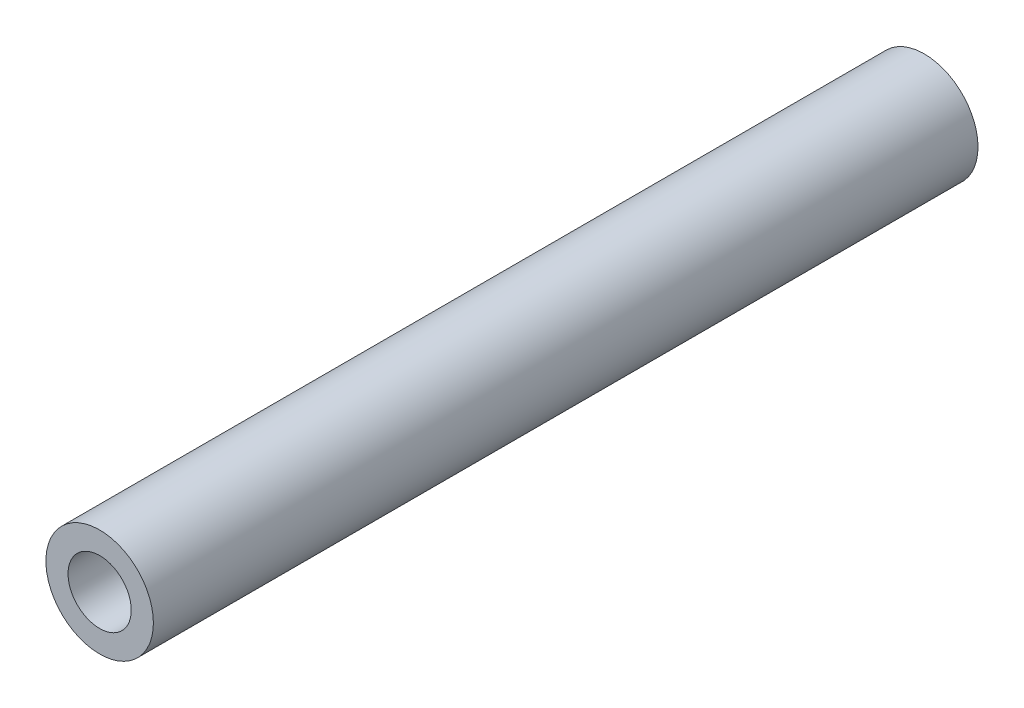
ISO-10303-21;
HEADER;
FILE_DESCRIPTION(('STEP AP214'),'2;1');
FILE_NAME('part.step','',(''),(''),'','','');
FILE_SCHEMA(('AUTOMOTIVE_DESIGN { 1 0 10303 214 1 1 1 1 }'));
ENDSEC;
DATA;
#1=APPLICATION_CONTEXT('core data for automotive mechanical design processes');
#2=APPLICATION_PROTOCOL_DEFINITION('international standard','automotive_design',2000,#1);
#3=PRODUCT_CONTEXT('',#1,'mechanical');
#4=PRODUCT('Part','Part','',(#3));
#5=PRODUCT_RELATED_PRODUCT_CATEGORY('part','',(#4));
#6=PRODUCT_DEFINITION_FORMATION('','',#4);
#7=PRODUCT_DEFINITION_CONTEXT('part definition',#1,'design');
#8=PRODUCT_DEFINITION('design','',#6,#7);
#9=PRODUCT_DEFINITION_SHAPE('','',#8);
#10=(LENGTH_UNIT() NAMED_UNIT(*) SI_UNIT(.MILLI.,.METRE.));
#11=(NAMED_UNIT(*) PLANE_ANGLE_UNIT() SI_UNIT($,.RADIAN.));
#12=(NAMED_UNIT(*) SI_UNIT($,.STERADIAN.) SOLID_ANGLE_UNIT());
#13=UNCERTAINTY_MEASURE_WITH_UNIT(LENGTH_MEASURE(1.E-05),#10,'distance_accuracy_value','');
#14=(GEOMETRIC_REPRESENTATION_CONTEXT(3) GLOBAL_UNCERTAINTY_ASSIGNED_CONTEXT((#13)) GLOBAL_UNIT_ASSIGNED_CONTEXT((#10,
#11,#12)) REPRESENTATION_CONTEXT('',''));
#15=CARTESIAN_POINT('',(0.,0.,0.));
#16=DIRECTION('',(0.,0.,1.));
#17=DIRECTION('',(1.,0.,0.));
#18=AXIS2_PLACEMENT_3D('',#15,#16,#17);
#19=CARTESIAN_POINT('',(0.,0.,60.));
#20=DIRECTION('',(0.,0.,1.));
#21=DIRECTION('',(1.,0.,0.));
#22=AXIS2_PLACEMENT_3D('',#19,#20,#21);
#23=PLANE('',#22);
#24=CARTESIAN_POINT('',(0.,0.,60.));
#25=DIRECTION('',(0.,0.,1.));
#26=DIRECTION('',(1.,0.,0.));
#27=AXIS2_PLACEMENT_3D('',#24,#25,#26);
#28=CIRCLE('',#27,3.91);
#29=CARTESIAN_POINT('',(3.91,0.,60.));
#30=VERTEX_POINT('',#29);
#31=EDGE_CURVE('E10',#30,#30,#28,.T.);
#32=ORIENTED_EDGE('',*,*,#31,.T.);
#33=EDGE_LOOP('',(#32));
#34=FACE_BOUND('',#33,.T.);
#35=CARTESIAN_POINT('',(0.,0.,60.));
#36=DIRECTION('',(0.,0.,1.));
#37=DIRECTION('',(1.,0.,0.));
#38=AXIS2_PLACEMENT_3D('',#35,#36,#37);
#39=CIRCLE('',#38,2.3);
#40=CARTESIAN_POINT('',(2.3,0.,60.));
#41=VERTEX_POINT('',#40);
#42=EDGE_CURVE('E50',#41,#41,#39,.T.);
#43=ORIENTED_EDGE('',*,*,#42,.F.);
#44=EDGE_LOOP('',(#43));
#45=FACE_BOUND('',#44,.T.);
#46=ADVANCED_FACE('F37',(#34,#45),#23,.T.);
#47=CARTESIAN_POINT('',(0.,0.,0.));
#48=DIRECTION('',(0.,0.,1.));
#49=DIRECTION('',(1.,0.,0.));
#50=AXIS2_PLACEMENT_3D('',#47,#48,#49);
#51=PLANE('',#50);
#52=CARTESIAN_POINT('',(0.,0.,0.));
#53=DIRECTION('',(0.,0.,1.));
#54=DIRECTION('',(1.,0.,0.));
#55=AXIS2_PLACEMENT_3D('',#52,#53,#54);
#56=CIRCLE('',#55,3.91);
#57=CARTESIAN_POINT('',(3.91,0.,0.));
#58=VERTEX_POINT('',#57);
#59=EDGE_CURVE('E41',#58,#58,#56,.T.);
#60=ORIENTED_EDGE('',*,*,#59,.F.);
#61=EDGE_LOOP('',(#60));
#62=FACE_BOUND('',#61,.T.);
#63=CARTESIAN_POINT('',(0.,0.,0.));
#64=DIRECTION('',(0.,0.,1.));
#65=DIRECTION('',(1.,0.,0.));
#66=AXIS2_PLACEMENT_3D('',#63,#64,#65);
#67=CIRCLE('',#66,2.3);
#68=CARTESIAN_POINT('',(2.3,0.,0.));
#69=VERTEX_POINT('',#68);
#70=EDGE_CURVE('E52',#69,#69,#67,.T.);
#71=ORIENTED_EDGE('',*,*,#70,.T.);
#72=EDGE_LOOP('',(#71));
#73=FACE_BOUND('',#72,.T.);
#74=ADVANCED_FACE('F64',(#62,#73),#51,.F.);
#75=CARTESIAN_POINT('',(0.,0.,60.));
#76=DIRECTION('',(0.,0.,-1.));
#77=DIRECTION('',(-1.,0.,0.));
#78=AXIS2_PLACEMENT_3D('',#75,#76,#77);
#79=CYLINDRICAL_SURFACE('',#78,3.91);
#80=ORIENTED_EDGE('',*,*,#31,.F.);
#81=EDGE_LOOP('',(#80));
#82=FACE_BOUND('',#81,.T.);
#83=ORIENTED_EDGE('',*,*,#59,.T.);
#84=EDGE_LOOP('',(#83));
#85=FACE_BOUND('',#84,.T.);
#86=ADVANCED_FACE('F39',(#82,#85),#79,.T.);
#87=CARTESIAN_POINT('',(0.,0.,60.));
#88=DIRECTION('',(0.,0.,-1.));
#89=DIRECTION('',(-1.,0.,0.));
#90=AXIS2_PLACEMENT_3D('',#87,#88,#89);
#91=CYLINDRICAL_SURFACE('',#90,2.3);
#92=ORIENTED_EDGE('',*,*,#42,.T.);
#93=EDGE_LOOP('',(#92));
#94=FACE_BOUND('',#93,.T.);
#95=ORIENTED_EDGE('',*,*,#70,.F.);
#96=EDGE_LOOP('',(#95));
#97=FACE_BOUND('',#96,.T.);
#98=ADVANCED_FACE('F60',(#94,#97),#91,.F.);
#99=CLOSED_SHELL('',(#46,#74,#86,#98));
#100=MANIFOLD_SOLID_BREP('B2',#99);
#101=ADVANCED_BREP_SHAPE_REPRESENTATION('',(#18,#100),#14);
#102=SHAPE_DEFINITION_REPRESENTATION(#9,#101);
ENDSEC;
END-ISO-10303-21;
